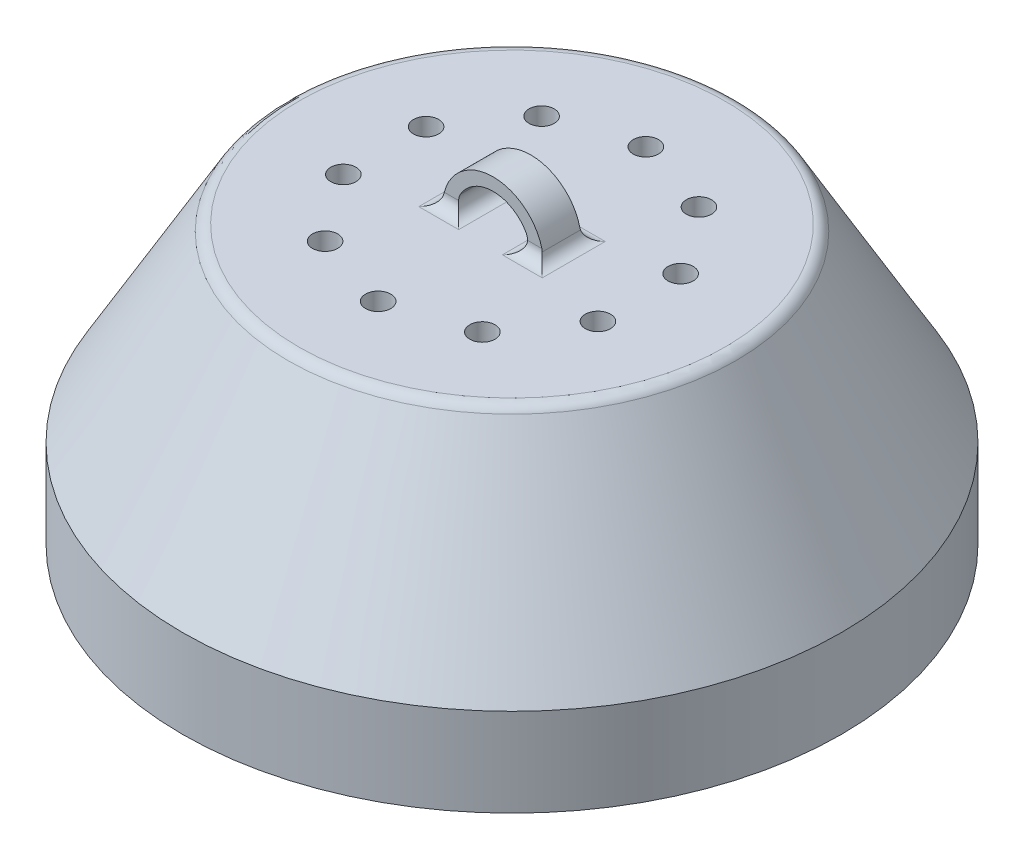
ISO-10303-21;
HEADER;
FILE_DESCRIPTION(('STEP AP214'),'2;1');
FILE_NAME('part.step','',(''),(''),'','','');
FILE_SCHEMA(('AUTOMOTIVE_DESIGN { 1 0 10303 214 1 1 1 1 }'));
ENDSEC;
DATA;
#1=APPLICATION_CONTEXT('core data for automotive mechanical design processes');
#2=APPLICATION_PROTOCOL_DEFINITION('international standard','automotive_design',2000,#1);
#3=PRODUCT_CONTEXT('',#1,'mechanical');
#4=PRODUCT('Part','Part','',(#3));
#5=PRODUCT_RELATED_PRODUCT_CATEGORY('part','',(#4));
#6=PRODUCT_DEFINITION_FORMATION('','',#4);
#7=PRODUCT_DEFINITION_CONTEXT('part definition',#1,'design');
#8=PRODUCT_DEFINITION('design','',#6,#7);
#9=PRODUCT_DEFINITION_SHAPE('','',#8);
#10=(LENGTH_UNIT() NAMED_UNIT(*) SI_UNIT(.MILLI.,.METRE.));
#11=(NAMED_UNIT(*) PLANE_ANGLE_UNIT() SI_UNIT($,.RADIAN.));
#12=(NAMED_UNIT(*) SI_UNIT($,.STERADIAN.) SOLID_ANGLE_UNIT());
#13=UNCERTAINTY_MEASURE_WITH_UNIT(LENGTH_MEASURE(1.E-05),#10,'distance_accuracy_value','');
#14=(GEOMETRIC_REPRESENTATION_CONTEXT(3) GLOBAL_UNCERTAINTY_ASSIGNED_CONTEXT((#13)) GLOBAL_UNIT_ASSIGNED_CONTEXT((#10,
#11,#12)) REPRESENTATION_CONTEXT('',''));
#15=CARTESIAN_POINT('',(0.,0.,0.));
#16=DIRECTION('',(0.,0.,1.));
#17=DIRECTION('',(1.,0.,0.));
#18=AXIS2_PLACEMENT_3D('',#15,#16,#17);
#19=CARTESIAN_POINT('',(0.,0.,0.));
#20=DIRECTION('',(0.,1.,0.));
#21=DIRECTION('',(0.,0.,1.));
#22=AXIS2_PLACEMENT_3D('',#19,#20,#21);
#23=PLANE('',#22);
#24=CARTESIAN_POINT('',(0.,0.,0.));
#25=DIRECTION('',(0.,1.,0.));
#26=DIRECTION('',(0.,0.,1.));
#27=AXIS2_PLACEMENT_3D('',#24,#25,#26);
#28=CIRCLE('',#27,25.75);
#29=CARTESIAN_POINT('',(0.,0.,25.75));
#30=VERTEX_POINT('',#29);
#31=EDGE_CURVE('E185',#30,#30,#28,.T.);
#32=ORIENTED_EDGE('',*,*,#31,.T.);
#33=EDGE_LOOP('',(#32));
#34=FACE_BOUND('',#33,.T.);
#35=CARTESIAN_POINT('',(0.,0.,0.));
#36=DIRECTION('',(0.,1.,0.));
#37=DIRECTION('',(0.,0.,1.));
#38=AXIS2_PLACEMENT_3D('',#35,#36,#37);
#39=CIRCLE('',#38,26.15);
#40=CARTESIAN_POINT('',(0.,0.,26.15));
#41=VERTEX_POINT('',#40);
#42=EDGE_CURVE('E312',#41,#41,#39,.T.);
#43=ORIENTED_EDGE('',*,*,#42,.F.);
#44=EDGE_LOOP('',(#43));
#45=FACE_BOUND('',#44,.T.);
#46=ADVANCED_FACE('F35',(#34,#45),#23,.F.);
#47=CARTESIAN_POINT('',(0.,7.,0.));
#48=DIRECTION('',(0.,-1.,0.));
#49=DIRECTION('',(0.,0.,-1.));
#50=AXIS2_PLACEMENT_3D('',#47,#48,#49);
#51=CYLINDRICAL_SURFACE('',#50,26.15);
#52=CARTESIAN_POINT('',(0.,7.,0.));
#53=DIRECTION('',(0.,1.,0.));
#54=DIRECTION('',(0.,0.,1.));
#55=AXIS2_PLACEMENT_3D('',#52,#53,#54);
#56=CIRCLE('',#55,26.15);
#57=CARTESIAN_POINT('',(0.,7.,26.15));
#58=VERTEX_POINT('',#57);
#59=EDGE_CURVE('E145',#58,#58,#56,.T.);
#60=ORIENTED_EDGE('',*,*,#59,.F.);
#61=EDGE_LOOP('',(#60));
#62=FACE_BOUND('',#61,.T.);
#63=ORIENTED_EDGE('',*,*,#42,.T.);
#64=EDGE_LOOP('',(#63));
#65=FACE_BOUND('',#64,.T.);
#66=ADVANCED_FACE('F253',(#62,#65),#51,.T.);
#67=CARTESIAN_POINT('',(0.,7.,0.));
#68=DIRECTION('',(0.,-1.,0.));
#69=DIRECTION('',(0.,0.,-1.));
#70=AXIS2_PLACEMENT_3D('',#67,#68,#69);
#71=CYLINDRICAL_SURFACE('',#70,24.75);
#72=CARTESIAN_POINT('',(0.,1.,0.));
#73=DIRECTION('',(0.,1.,0.));
#74=DIRECTION('',(0.,0.,1.));
#75=AXIS2_PLACEMENT_3D('',#72,#73,#74);
#76=CIRCLE('',#75,24.75);
#77=CARTESIAN_POINT('',(0.,1.,24.75));
#78=VERTEX_POINT('',#77);
#79=EDGE_CURVE('E188',#78,#78,#76,.F.);
#80=ORIENTED_EDGE('',*,*,#79,.T.);
#81=EDGE_LOOP('',(#80));
#82=FACE_BOUND('',#81,.T.);
#83=CARTESIAN_POINT('',(0.,7.,0.));
#84=DIRECTION('',(0.,-1.,0.));
#85=DIRECTION('',(0.,0.,-1.));
#86=AXIS2_PLACEMENT_3D('',#83,#84,#85);
#87=CIRCLE('',#86,24.75);
#88=CARTESIAN_POINT('',(0.,7.,-24.75));
#89=VERTEX_POINT('',#88);
#90=EDGE_CURVE('E315',#89,#89,#87,.T.);
#91=ORIENTED_EDGE('',*,*,#90,.F.);
#92=EDGE_LOOP('',(#91));
#93=FACE_BOUND('',#92,.T.);
#94=ADVANCED_FACE('F259',(#82,#93),#71,.F.);
#95=CARTESIAN_POINT('',(0.,7.,0.));
#96=DIRECTION('',(0.,-1.,0.));
#97=DIRECTION('',(0.,0.,1.));
#98=AXIS2_PLACEMENT_3D('',#95,#96,#97);
#99=CONICAL_SURFACE('',#98,26.15,0.5235987755983);
#100=CARTESIAN_POINT('',(0.,21.5,0.));
#101=DIRECTION('',(0.,-1.,0.));
#102=DIRECTION('',(0.,0.,-1.));
#103=AXIS2_PLACEMENT_3D('',#100,#101,#102);
#104=CIRCLE('',#103,17.7784210967504);
#105=CARTESIAN_POINT('',(0.,21.5,-17.7784210967504));
#106=VERTEX_POINT('',#105);
#107=EDGE_CURVE('E166',#106,#106,#104,.T.);
#108=ORIENTED_EDGE('',*,*,#107,.T.);
#109=EDGE_LOOP('',(#108));
#110=FACE_BOUND('',#109,.T.);
#111=ORIENTED_EDGE('',*,*,#59,.T.);
#112=EDGE_LOOP('',(#111));
#113=FACE_BOUND('',#112,.T.);
#114=ADVANCED_FACE('F284',(#110,#113),#99,.T.);
#115=CARTESIAN_POINT('',(0.,22.,0.));
#116=DIRECTION('',(0.,1.,0.));
#117=DIRECTION('',(0.,0.,1.));
#118=AXIS2_PLACEMENT_3D('',#115,#116,#117);
#119=PLANE('',#118);
#120=CARTESIAN_POINT('',(-6.24248112315431,22.,-8.59203815679193));
#121=DIRECTION('',(0.,1.,0.));
#122=DIRECTION('',(0.,0.,1.));
#123=AXIS2_PLACEMENT_3D('',#120,#121,#122);
#124=CIRCLE('',#123,1.0000000000004);
#125=CARTESIAN_POINT('',(-6.24248112315431,22.,-7.59203815679153));
#126=VERTEX_POINT('',#125);
#127=EDGE_CURVE('E390',#126,#126,#124,.T.);
#128=ORIENTED_EDGE('',*,*,#127,.F.);
#129=EDGE_LOOP('',(#128));
#130=FACE_BOUND('',#129,.T.);
#131=CARTESIAN_POINT('',(-10.100546631393,22.,-3.28186654325797));
#132=DIRECTION('',(0.,1.,0.));
#133=DIRECTION('',(0.,0.,1.));
#134=AXIS2_PLACEMENT_3D('',#131,#132,#133);
#135=CIRCLE('',#134,1.00000000000082);
#136=CARTESIAN_POINT('',(-10.100546631393,22.,-2.28186654325714));
#137=VERTEX_POINT('',#136);
#138=EDGE_CURVE('E384',#137,#137,#135,.T.);
#139=ORIENTED_EDGE('',*,*,#138,.F.);
#140=EDGE_LOOP('',(#139));
#141=FACE_BOUND('',#140,.T.);
#142=CARTESIAN_POINT('',(-10.1005466313925,22.,3.2818665432594));
#143=DIRECTION('',(0.,1.,0.));
#144=DIRECTION('',(0.,0.,1.));
#145=AXIS2_PLACEMENT_3D('',#142,#143,#144);
#146=CIRCLE('',#145,1.00000000000125);
#147=CARTESIAN_POINT('',(-10.1005466313925,22.,4.28186654326066));
#148=VERTEX_POINT('',#147);
#149=EDGE_CURVE('E378',#148,#148,#146,.T.);
#150=ORIENTED_EDGE('',*,*,#149,.F.);
#151=EDGE_LOOP('',(#150));
#152=FACE_BOUND('',#151,.T.);
#153=CARTESIAN_POINT('',(-6.24248112315309,22.,8.59203815679281));
#154=DIRECTION('',(0.,1.,0.));
#155=DIRECTION('',(0.,0.,1.));
#156=AXIS2_PLACEMENT_3D('',#153,#154,#155);
#157=CIRCLE('',#156,1.00000000000152);
#158=CARTESIAN_POINT('',(-6.24248112315309,22.,9.59203815679433));
#159=VERTEX_POINT('',#158);
#160=EDGE_CURVE('E372',#159,#159,#157,.T.);
#161=ORIENTED_EDGE('',*,*,#160,.F.);
#162=EDGE_LOOP('',(#161));
#163=FACE_BOUND('',#162,.T.);
#164=CARTESIAN_POINT('',(1.50664031238656E-12,22.,10.6203432270674));
#165=DIRECTION('',(0.,1.,0.));
#166=DIRECTION('',(0.,0.,1.));
#167=AXIS2_PLACEMENT_3D('',#164,#165,#166);
#168=CIRCLE('',#167,1.00000000000151);
#169=CARTESIAN_POINT('',(1.50664031238656E-12,22.,11.6203432270689));
#170=VERTEX_POINT('',#169);
#171=EDGE_CURVE('E366',#170,#170,#168,.T.);
#172=ORIENTED_EDGE('',*,*,#171,.F.);
#173=EDGE_LOOP('',(#172));
#174=FACE_BOUND('',#173,.T.);
#175=CARTESIAN_POINT('',(6.24248112315581,22.,8.59203815679193));
#176=DIRECTION('',(0.,1.,0.));
#177=DIRECTION('',(0.,0.,1.));
#178=AXIS2_PLACEMENT_3D('',#175,#176,#177);
#179=CIRCLE('',#178,1.00000000000123);
#180=CARTESIAN_POINT('',(6.24248112315581,22.,9.59203815679316));
#181=VERTEX_POINT('',#180);
#182=EDGE_CURVE('E360',#181,#181,#179,.T.);
#183=ORIENTED_EDGE('',*,*,#182,.F.);
#184=EDGE_LOOP('',(#183));
#185=FACE_BOUND('',#184,.T.);
#186=CARTESIAN_POINT('',(10.1005466313945,22.,3.28186654325797));
#187=DIRECTION('',(0.,1.,0.));
#188=DIRECTION('',(0.,0.,1.));
#189=AXIS2_PLACEMENT_3D('',#186,#187,#188);
#190=CIRCLE('',#189,1.00000000000078);
#191=CARTESIAN_POINT('',(10.1005466313945,22.,4.28186654325875));
#192=VERTEX_POINT('',#191);
#193=EDGE_CURVE('E354',#192,#192,#190,.T.);
#194=ORIENTED_EDGE('',*,*,#193,.F.);
#195=EDGE_LOOP('',(#194));
#196=FACE_BOUND('',#195,.T.);
#197=CARTESIAN_POINT('',(10.100546631394,22.,-3.2818665432594));
#198=DIRECTION('',(0.,1.,0.));
#199=DIRECTION('',(0.,0.,1.));
#200=AXIS2_PLACEMENT_3D('',#197,#198,#199);
#201=CIRCLE('',#200,1.00000000000032);
#202=CARTESIAN_POINT('',(10.100546631394,22.,-2.28186654325909));
#203=VERTEX_POINT('',#202);
#204=EDGE_CURVE('E348',#203,#203,#201,.T.);
#205=ORIENTED_EDGE('',*,*,#204,.F.);
#206=EDGE_LOOP('',(#205));
#207=FACE_BOUND('',#206,.T.);
#208=CARTESIAN_POINT('',(6.2424811231546,22.,-8.59203815679281));
#209=DIRECTION('',(0.,1.,0.));
#210=DIRECTION('',(0.,0.,1.));
#211=AXIS2_PLACEMENT_3D('',#208,#209,#210);
#212=CIRCLE('',#211,1.00000000000002);
#213=CARTESIAN_POINT('',(6.2424811231546,22.,-7.59203815679279));
#214=VERTEX_POINT('',#213);
#215=EDGE_CURVE('E342',#214,#214,#212,.T.);
#216=ORIENTED_EDGE('',*,*,#215,.F.);
#217=EDGE_LOOP('',(#216));
#218=FACE_BOUND('',#217,.T.);
#219=CARTESIAN_POINT('',(0.,22.,-10.6203432270674));
#220=DIRECTION('',(0.,1.,0.));
#221=DIRECTION('',(0.,0.,1.));
#222=AXIS2_PLACEMENT_3D('',#219,#220,#221);
#223=CIRCLE('',#222,1.);
#224=CARTESIAN_POINT('',(0.,22.,-9.62034322706737));
#225=VERTEX_POINT('',#224);
#226=EDGE_CURVE('E336',#225,#225,#223,.T.);
#227=ORIENTED_EDGE('',*,*,#226,.F.);
#228=EDGE_LOOP('',(#227));
#229=FACE_BOUND('',#228,.T.);
#230=CARTESIAN_POINT('',(0.,22.,0.));
#231=DIRECTION('',(0.,1.,0.));
#232=DIRECTION('',(0.,0.,1.));
#233=AXIS2_PLACEMENT_3D('',#230,#231,#232);
#234=CIRCLE('',#233,16.912395692966);
#235=CARTESIAN_POINT('',(0.,22.,16.912395692966));
#236=VERTEX_POINT('',#235);
#237=EDGE_CURVE('E163',#236,#236,#234,.T.);
#238=ORIENTED_EDGE('',*,*,#237,.T.);
#239=EDGE_LOOP('',(#238));
#240=FACE_BOUND('',#239,.T.);
#241=DIRECTION('',(1.,0.,0.));
#242=VECTOR('',#241,1.);
#243=CARTESIAN_POINT('',(0.,22.,-2.5));
#244=LINE('',#243,#242);
#245=CARTESIAN_POINT('',(1.73205080756888,22.,-2.5));
#246=VERTEX_POINT('',#245);
#247=CARTESIAN_POINT('',(4.89897948556636,22.,-2.5));
#248=VERTEX_POINT('',#247);
#249=EDGE_CURVE('E158',#246,#248,#244,.T.);
#250=ORIENTED_EDGE('',*,*,#249,.T.);
#251=DIRECTION('',(0.,0.,-1.));
#252=VECTOR('',#251,1.);
#253=CARTESIAN_POINT('',(4.89897948556636,22.,0.));
#254=LINE('',#253,#252);
#255=CARTESIAN_POINT('',(4.89897948556636,22.,2.5));
#256=VERTEX_POINT('',#255);
#257=EDGE_CURVE('E160',#248,#256,#254,.F.);
#258=ORIENTED_EDGE('',*,*,#257,.T.);
#259=DIRECTION('',(1.,0.,0.));
#260=VECTOR('',#259,1.);
#261=CARTESIAN_POINT('',(3.,22.,2.5));
#262=LINE('',#261,#260);
#263=CARTESIAN_POINT('',(1.73205080756888,22.,2.5));
#264=VERTEX_POINT('',#263);
#265=EDGE_CURVE('E150',#256,#264,#262,.F.);
#266=ORIENTED_EDGE('',*,*,#265,.T.);
#267=DIRECTION('',(0.,0.,-1.));
#268=VECTOR('',#267,1.);
#269=CARTESIAN_POINT('',(1.73205080756888,22.,0.));
#270=LINE('',#269,#268);
#271=EDGE_CURVE('E152',#264,#246,#270,.T.);
#272=ORIENTED_EDGE('',*,*,#271,.T.);
#273=EDGE_LOOP('',(#250,#258,#266,#272));
#274=FACE_BOUND('',#273,.T.);
#275=DIRECTION('',(1.,0.,0.));
#276=VECTOR('',#275,1.);
#277=CARTESIAN_POINT('',(0.,22.,-2.5));
#278=LINE('',#277,#276);
#279=CARTESIAN_POINT('',(-4.89897948556636,22.,-2.5));
#280=VERTEX_POINT('',#279);
#281=CARTESIAN_POINT('',(-1.73205080756888,22.,-2.5));
#282=VERTEX_POINT('',#281);
#283=EDGE_CURVE('E149',#280,#282,#278,.T.);
#284=ORIENTED_EDGE('',*,*,#283,.T.);
#285=DIRECTION('',(0.,0.,-1.));
#286=VECTOR('',#285,1.);
#287=CARTESIAN_POINT('',(-1.73205080756888,22.,0.));
#288=LINE('',#287,#286);
#289=CARTESIAN_POINT('',(-1.73205080756888,22.,2.5));
#290=VERTEX_POINT('',#289);
#291=EDGE_CURVE('E129',#282,#290,#288,.F.);
#292=ORIENTED_EDGE('',*,*,#291,.T.);
#293=DIRECTION('',(1.,0.,0.));
#294=VECTOR('',#293,1.);
#295=CARTESIAN_POINT('',(-4.,22.,2.5));
#296=LINE('',#295,#294);
#297=CARTESIAN_POINT('',(-4.89897948556636,22.,2.5));
#298=VERTEX_POINT('',#297);
#299=EDGE_CURVE('E139',#290,#298,#296,.F.);
#300=ORIENTED_EDGE('',*,*,#299,.T.);
#301=DIRECTION('',(0.,0.,-1.));
#302=VECTOR('',#301,1.);
#303=CARTESIAN_POINT('',(-4.89897948556636,22.,0.));
#304=LINE('',#303,#302);
#305=EDGE_CURVE('E144',#298,#280,#304,.T.);
#306=ORIENTED_EDGE('',*,*,#305,.T.);
#307=EDGE_LOOP('',(#284,#292,#300,#306));
#308=FACE_BOUND('',#307,.T.);
#309=ADVANCED_FACE('F147',(#130,#141,#152,#163,#174,#185,#196,#207,#218,#229,#240,#274,#308),
#119,.T.);
#310=CARTESIAN_POINT('',(0.,7.,0.));
#311=DIRECTION('',(0.,-1.,0.));
#312=DIRECTION('',(0.,0.,-1.));
#313=AXIS2_PLACEMENT_3D('',#310,#311,#312);
#314=CONICAL_SURFACE('',#313,24.75,0.5235987755983);
#315=ORIENTED_EDGE('',*,*,#90,.T.);
#316=EDGE_LOOP('',(#315));
#317=FACE_BOUND('',#316,.T.);
#318=CARTESIAN_POINT('',(0.,20.5,0.));
#319=DIRECTION('',(0.,1.,0.));
#320=DIRECTION('',(0.,0.,1.));
#321=AXIS2_PLACEMENT_3D('',#318,#319,#320);
#322=CIRCLE('',#321,16.95577136594);
#323=CARTESIAN_POINT('',(0.,20.5,16.95577136594));
#324=VERTEX_POINT('',#323);
#325=EDGE_CURVE('E318',#324,#324,#322,.F.);
#326=ORIENTED_EDGE('',*,*,#325,.F.);
#327=EDGE_LOOP('',(#326));
#328=FACE_BOUND('',#327,.T.);
#329=ADVANCED_FACE('F283',(#317,#328),#314,.F.);
#330=CARTESIAN_POINT('',(0.,20.5,0.));
#331=DIRECTION('',(0.,1.,0.));
#332=DIRECTION('',(0.,0.,1.));
#333=AXIS2_PLACEMENT_3D('',#330,#331,#332);
#334=PLANE('',#333);
#335=CARTESIAN_POINT('',(-6.24248112315431,20.5,-8.59203815679193));
#336=DIRECTION('',(0.,1.,0.));
#337=DIRECTION('',(0.,0.,1.));
#338=AXIS2_PLACEMENT_3D('',#335,#336,#337);
#339=CIRCLE('',#338,1.0000000000004);
#340=CARTESIAN_POINT('',(-6.24248112315431,20.5,-7.59203815679153));
#341=VERTEX_POINT('',#340);
#342=EDGE_CURVE('E387',#341,#341,#339,.F.);
#343=ORIENTED_EDGE('',*,*,#342,.F.);
#344=EDGE_LOOP('',(#343));
#345=FACE_BOUND('',#344,.T.);
#346=CARTESIAN_POINT('',(-10.100546631393,20.5,-3.28186654325797));
#347=DIRECTION('',(0.,1.,0.));
#348=DIRECTION('',(0.,0.,1.));
#349=AXIS2_PLACEMENT_3D('',#346,#347,#348);
#350=CIRCLE('',#349,1.00000000000082);
#351=CARTESIAN_POINT('',(-10.100546631393,20.5,-2.28186654325714));
#352=VERTEX_POINT('',#351);
#353=EDGE_CURVE('E381',#352,#352,#350,.F.);
#354=ORIENTED_EDGE('',*,*,#353,.F.);
#355=EDGE_LOOP('',(#354));
#356=FACE_BOUND('',#355,.T.);
#357=CARTESIAN_POINT('',(-10.1005466313925,20.5,3.2818665432594));
#358=DIRECTION('',(0.,1.,0.));
#359=DIRECTION('',(0.,0.,1.));
#360=AXIS2_PLACEMENT_3D('',#357,#358,#359);
#361=CIRCLE('',#360,1.00000000000125);
#362=CARTESIAN_POINT('',(-10.1005466313925,20.5,4.28186654326066));
#363=VERTEX_POINT('',#362);
#364=EDGE_CURVE('E375',#363,#363,#361,.F.);
#365=ORIENTED_EDGE('',*,*,#364,.F.);
#366=EDGE_LOOP('',(#365));
#367=FACE_BOUND('',#366,.T.);
#368=CARTESIAN_POINT('',(-6.24248112315309,20.5,8.59203815679281));
#369=DIRECTION('',(0.,1.,0.));
#370=DIRECTION('',(0.,0.,1.));
#371=AXIS2_PLACEMENT_3D('',#368,#369,#370);
#372=CIRCLE('',#371,1.00000000000152);
#373=CARTESIAN_POINT('',(-6.24248112315309,20.5,9.59203815679433));
#374=VERTEX_POINT('',#373);
#375=EDGE_CURVE('E369',#374,#374,#372,.F.);
#376=ORIENTED_EDGE('',*,*,#375,.F.);
#377=EDGE_LOOP('',(#376));
#378=FACE_BOUND('',#377,.T.);
#379=CARTESIAN_POINT('',(1.50664031238656E-12,20.5,10.6203432270674));
#380=DIRECTION('',(0.,1.,0.));
#381=DIRECTION('',(0.,0.,1.));
#382=AXIS2_PLACEMENT_3D('',#379,#380,#381);
#383=CIRCLE('',#382,1.00000000000151);
#384=CARTESIAN_POINT('',(1.50664031238656E-12,20.5,11.6203432270689));
#385=VERTEX_POINT('',#384);
#386=EDGE_CURVE('E363',#385,#385,#383,.F.);
#387=ORIENTED_EDGE('',*,*,#386,.F.);
#388=EDGE_LOOP('',(#387));
#389=FACE_BOUND('',#388,.T.);
#390=CARTESIAN_POINT('',(6.24248112315581,20.5,8.59203815679193));
#391=DIRECTION('',(0.,1.,0.));
#392=DIRECTION('',(0.,0.,1.));
#393=AXIS2_PLACEMENT_3D('',#390,#391,#392);
#394=CIRCLE('',#393,1.00000000000123);
#395=CARTESIAN_POINT('',(6.24248112315581,20.5,9.59203815679316));
#396=VERTEX_POINT('',#395);
#397=EDGE_CURVE('E357',#396,#396,#394,.F.);
#398=ORIENTED_EDGE('',*,*,#397,.F.);
#399=EDGE_LOOP('',(#398));
#400=FACE_BOUND('',#399,.T.);
#401=CARTESIAN_POINT('',(10.1005466313945,20.5,3.28186654325797));
#402=DIRECTION('',(0.,1.,0.));
#403=DIRECTION('',(0.,0.,1.));
#404=AXIS2_PLACEMENT_3D('',#401,#402,#403);
#405=CIRCLE('',#404,1.00000000000078);
#406=CARTESIAN_POINT('',(10.1005466313945,20.5,4.28186654325875));
#407=VERTEX_POINT('',#406);
#408=EDGE_CURVE('E351',#407,#407,#405,.F.);
#409=ORIENTED_EDGE('',*,*,#408,.F.);
#410=EDGE_LOOP('',(#409));
#411=FACE_BOUND('',#410,.T.);
#412=CARTESIAN_POINT('',(10.100546631394,20.5,-3.2818665432594));
#413=DIRECTION('',(0.,1.,0.));
#414=DIRECTION('',(0.,0.,1.));
#415=AXIS2_PLACEMENT_3D('',#412,#413,#414);
#416=CIRCLE('',#415,1.00000000000032);
#417=CARTESIAN_POINT('',(10.100546631394,20.5,-2.28186654325909));
#418=VERTEX_POINT('',#417);
#419=EDGE_CURVE('E345',#418,#418,#416,.F.);
#420=ORIENTED_EDGE('',*,*,#419,.F.);
#421=EDGE_LOOP('',(#420));
#422=FACE_BOUND('',#421,.T.);
#423=CARTESIAN_POINT('',(6.2424811231546,20.5,-8.59203815679281));
#424=DIRECTION('',(0.,1.,0.));
#425=DIRECTION('',(0.,0.,1.));
#426=AXIS2_PLACEMENT_3D('',#423,#424,#425);
#427=CIRCLE('',#426,1.00000000000002);
#428=CARTESIAN_POINT('',(6.2424811231546,20.5,-7.59203815679279));
#429=VERTEX_POINT('',#428);
#430=EDGE_CURVE('E339',#429,#429,#427,.F.);
#431=ORIENTED_EDGE('',*,*,#430,.F.);
#432=EDGE_LOOP('',(#431));
#433=FACE_BOUND('',#432,.T.);
#434=CARTESIAN_POINT('',(0.,20.5,-10.6203432270674));
#435=DIRECTION('',(0.,1.,0.));
#436=DIRECTION('',(0.,0.,1.));
#437=AXIS2_PLACEMENT_3D('',#434,#435,#436);
#438=CIRCLE('',#437,1.);
#439=CARTESIAN_POINT('',(0.,20.5,-9.62034322706737));
#440=VERTEX_POINT('',#439);
#441=EDGE_CURVE('E308',#440,#440,#438,.F.);
#442=ORIENTED_EDGE('',*,*,#441,.F.);
#443=EDGE_LOOP('',(#442));
#444=FACE_BOUND('',#443,.T.);
#445=ORIENTED_EDGE('',*,*,#325,.T.);
#446=EDGE_LOOP('',(#445));
#447=FACE_BOUND('',#446,.T.);
#448=ADVANCED_FACE('F422',(#345,#356,#367,#378,#389,#400,#411,#422,#433,#444,#447),#334,.F.);
#449=CARTESIAN_POINT('',(0.,22.,1.5));
#450=DIRECTION('',(0.,0.,-1.));
#451=DIRECTION('',(-1.,0.,0.));
#452=AXIS2_PLACEMENT_3D('',#449,#450,#451);
#453=CYLINDRICAL_SURFACE('',#452,4.);
#454=CARTESIAN_POINT('',(0.,22.,1.5));
#455=DIRECTION('',(0.,0.,1.));
#456=DIRECTION('',(1.,0.,0.));
#457=AXIS2_PLACEMENT_3D('',#454,#455,#456);
#458=CIRCLE('',#457,4.);
#459=CARTESIAN_POINT('',(3.87298334620742,23.,1.5));
#460=VERTEX_POINT('',#459);
#461=CARTESIAN_POINT('',(-3.87298334620742,23.,1.5));
#462=VERTEX_POINT('',#461);
#463=EDGE_CURVE('E327',#460,#462,#458,.T.);
#464=ORIENTED_EDGE('',*,*,#463,.F.);
#465=CARTESIAN_POINT('',(3.87298334620742,23.,1.5));
#466=CARTESIAN_POINT('',(3.88161367079,22.9665400879856,1.49998709194956));
#467=CARTESIAN_POINT('',(3.88977885326883,22.9331434653097,1.5016643131653));
#468=CARTESIAN_POINT('',(3.90517893401717,22.8664767986431,1.50839901412834));
#469=CARTESIAN_POINT('',(3.91241383228689,22.8332067546523,1.51345649387485));
#470=CARTESIAN_POINT('',(3.91918358845308,22.8,1.52020410288673));
#471=B_SPLINE_CURVE_WITH_KNOTS('',3,(#465,#466,#467,#468,#469,#470),.UNSPECIFIED.,.F.,.F.,(4,2,
4),(0.,0.103263542156258,0.206527084287963),.UNSPECIFIED.);
#472=CARTESIAN_POINT('',(3.91918358845308,22.8,1.52020410288673));
#473=VERTEX_POINT('',#472);
#474=EDGE_CURVE('E220',#460,#473,#471,.T.);
#475=ORIENTED_EDGE('',*,*,#474,.T.);
#476=DIRECTION('',(0.,0.,-1.));
#477=VECTOR('',#476,1.);
#478=CARTESIAN_POINT('',(3.91918358845309,22.8,1.5));
#479=LINE('',#478,#477);
#480=CARTESIAN_POINT('',(3.91918358845308,22.8,-1.52020410288673));
#481=VERTEX_POINT('',#480);
#482=EDGE_CURVE('E170',#473,#481,#479,.T.);
#483=ORIENTED_EDGE('',*,*,#482,.T.);
#484=CARTESIAN_POINT('',(3.91918358845308,22.8,-1.52020410288673));
#485=CARTESIAN_POINT('',(3.91241383228687,22.8332067546522,-1.51345649387486));
#486=CARTESIAN_POINT('',(3.90517893401715,22.8664767986431,-1.50839901412835));
#487=CARTESIAN_POINT('',(3.88977885326885,22.9331434653097,-1.50166431316529));
#488=CARTESIAN_POINT('',(3.88161367079005,22.9665400879856,-1.49998709194953));
#489=CARTESIAN_POINT('',(3.87298334620752,23.,-1.49999999999995));
#490=B_SPLINE_CURVE_WITH_KNOTS('',3,(#484,#485,#486,#487,#488,#489),.UNSPECIFIED.,.F.,.F.,(4,2,
4),(0.,0.103263542131702,0.206527084287951),.UNSPECIFIED.);
#491=CARTESIAN_POINT('',(3.87298334620742,23.,-1.5));
#492=VERTEX_POINT('',#491);
#493=EDGE_CURVE('E191',#481,#492,#490,.T.);
#494=ORIENTED_EDGE('',*,*,#493,.T.);
#495=CARTESIAN_POINT('',(0.,22.,-1.5));
#496=DIRECTION('',(0.,0.,1.));
#497=DIRECTION('',(1.,0.,0.));
#498=AXIS2_PLACEMENT_3D('',#495,#496,#497);
#499=CIRCLE('',#498,4.);
#500=CARTESIAN_POINT('',(-3.87298334620742,23.,-1.5));
#501=VERTEX_POINT('',#500);
#502=EDGE_CURVE('E307',#492,#501,#499,.T.);
#503=ORIENTED_EDGE('',*,*,#502,.T.);
#504=CARTESIAN_POINT('',(-3.87298334620742,23.,-1.5));
#505=CARTESIAN_POINT('',(-3.88161367079,22.9665400879856,-1.49998709194956));
#506=CARTESIAN_POINT('',(-3.88977885326883,22.9331434653097,-1.5016643131653));
#507=CARTESIAN_POINT('',(-3.90517893401717,22.8664767986431,-1.50839901412834));
#508=CARTESIAN_POINT('',(-3.91241383228689,22.8332067546523,-1.51345649387485));
#509=CARTESIAN_POINT('',(-3.91918358845308,22.8,-1.52020410288673));
#510=B_SPLINE_CURVE_WITH_KNOTS('',3,(#504,#505,#506,#507,#508,#509),.UNSPECIFIED.,.F.,.F.,(4,2,
4),(0.,0.103263542156258,0.206527084287963),.UNSPECIFIED.);
#511=CARTESIAN_POINT('',(-3.91918358845308,22.8,-1.52020410288673));
#512=VERTEX_POINT('',#511);
#513=EDGE_CURVE('E44',#501,#512,#510,.T.);
#514=ORIENTED_EDGE('',*,*,#513,.T.);
#515=DIRECTION('',(0.,0.,-1.));
#516=VECTOR('',#515,1.);
#517=CARTESIAN_POINT('',(-3.91918358845309,22.8,1.5));
#518=LINE('',#517,#516);
#519=CARTESIAN_POINT('',(-3.91918358845308,22.8,1.52020410288673));
#520=VERTEX_POINT('',#519);
#521=EDGE_CURVE('E51',#512,#520,#518,.F.);
#522=ORIENTED_EDGE('',*,*,#521,.T.);
#523=CARTESIAN_POINT('',(-3.91918358845308,22.8,1.52020410288673));
#524=CARTESIAN_POINT('',(-3.91241383228687,22.8332067546522,1.51345649387486));
#525=CARTESIAN_POINT('',(-3.90517893401715,22.8664767986431,1.50839901412835));
#526=CARTESIAN_POINT('',(-3.88977885326885,22.9331434653097,1.50166431316529));
#527=CARTESIAN_POINT('',(-3.88161367079005,22.9665400879856,1.49998709194953));
#528=CARTESIAN_POINT('',(-3.87298334620752,23.,1.49999999999995));
#529=B_SPLINE_CURVE_WITH_KNOTS('',3,(#523,#524,#525,#526,#527,#528),.UNSPECIFIED.,.F.,.F.,(4,2,
4),(0.,0.103263542131702,0.206527084287951),.UNSPECIFIED.);
#530=EDGE_CURVE('E12',#520,#462,#529,.T.);
#531=ORIENTED_EDGE('',*,*,#530,.T.);
#532=EDGE_LOOP('',(#464,#475,#483,#494,#503,#514,#522,#531));
#533=FACE_BOUND('',#532,.T.);
#534=ADVANCED_FACE('F200',(#533),#453,.T.);
#535=CARTESIAN_POINT('',(0.,22.,1.5));
#536=DIRECTION('',(0.,0.,-1.));
#537=DIRECTION('',(-1.,0.,0.));
#538=AXIS2_PLACEMENT_3D('',#535,#536,#537);
#539=CYLINDRICAL_SURFACE('',#538,3.);
#540=CARTESIAN_POINT('',(0.,22.,-1.5));
#541=DIRECTION('',(0.,0.,-1.));
#542=DIRECTION('',(1.,0.,0.));
#543=AXIS2_PLACEMENT_3D('',#540,#541,#542);
#544=CIRCLE('',#543,3.);
#545=CARTESIAN_POINT('',(-2.59807621135332,23.5,-1.5));
#546=VERTEX_POINT('',#545);
#547=CARTESIAN_POINT('',(2.59807621135332,23.5,-1.5));
#548=VERTEX_POINT('',#547);
#549=EDGE_CURVE('E324',#546,#548,#544,.T.);
#550=ORIENTED_EDGE('',*,*,#549,.T.);
#551=DIRECTION('',(0.,0.,-1.));
#552=VECTOR('',#551,1.);
#553=CARTESIAN_POINT('',(2.59807621135332,23.5,1.5));
#554=LINE('',#553,#552);
#555=CARTESIAN_POINT('',(2.59807621135332,23.5,1.5));
#556=VERTEX_POINT('',#555);
#557=EDGE_CURVE('E179',#548,#556,#554,.F.);
#558=ORIENTED_EDGE('',*,*,#557,.T.);
#559=CARTESIAN_POINT('',(0.,22.,1.5));
#560=DIRECTION('',(0.,0.,-1.));
#561=DIRECTION('',(1.,0.,0.));
#562=AXIS2_PLACEMENT_3D('',#559,#560,#561);
#563=CIRCLE('',#562,3.);
#564=CARTESIAN_POINT('',(-2.59807621135332,23.5,1.5));
#565=VERTEX_POINT('',#564);
#566=EDGE_CURVE('E321',#565,#556,#563,.T.);
#567=ORIENTED_EDGE('',*,*,#566,.F.);
#568=DIRECTION('',(0.,0.,-1.));
#569=VECTOR('',#568,1.);
#570=CARTESIAN_POINT('',(-2.59807621135332,23.5,1.5));
#571=LINE('',#570,#569);
#572=EDGE_CURVE('E176',#565,#546,#571,.T.);
#573=ORIENTED_EDGE('',*,*,#572,.T.);
#574=EDGE_LOOP('',(#550,#558,#567,#573));
#575=FACE_BOUND('',#574,.T.);
#576=ADVANCED_FACE('F514',(#575),#539,.F.);
#577=CARTESIAN_POINT('',(0.,22.,1.5));
#578=DIRECTION('',(0.,0.,1.));
#579=DIRECTION('',(1.,0.,0.));
#580=AXIS2_PLACEMENT_3D('',#577,#578,#579);
#581=PLANE('',#580);
#582=CARTESIAN_POINT('',(1.73205080756888,23.,1.5));
#583=DIRECTION('',(0.,0.,1.));
#584=DIRECTION('',(1.,0.,0.));
#585=AXIS2_PLACEMENT_3D('',#582,#583,#584);
#586=CIRCLE('',#585,1.);
#587=CARTESIAN_POINT('',(2.73205080756888,23.,1.5));
#588=VERTEX_POINT('',#587);
#589=EDGE_CURVE('E227',#556,#588,#586,.F.);
#590=ORIENTED_EDGE('',*,*,#589,.T.);
#591=DIRECTION('',(1.,0.,0.));
#592=VECTOR('',#591,1.);
#593=CARTESIAN_POINT('',(4.,23.,1.5));
#594=LINE('',#593,#592);
#595=EDGE_CURVE('E183',#588,#460,#594,.T.);
#596=ORIENTED_EDGE('',*,*,#595,.T.);
#597=ORIENTED_EDGE('',*,*,#463,.T.);
#598=DIRECTION('',(1.,0.,0.));
#599=VECTOR('',#598,1.);
#600=CARTESIAN_POINT('',(-3.,23.,1.5));
#601=LINE('',#600,#599);
#602=CARTESIAN_POINT('',(-2.73205080756888,23.,1.5));
#603=VERTEX_POINT('',#602);
#604=EDGE_CURVE('E181',#462,#603,#601,.T.);
#605=ORIENTED_EDGE('',*,*,#604,.T.);
#606=CARTESIAN_POINT('',(-1.73205080756888,23.,1.5));
#607=DIRECTION('',(0.,0.,1.));
#608=DIRECTION('',(1.,0.,0.));
#609=AXIS2_PLACEMENT_3D('',#606,#607,#608);
#610=CIRCLE('',#609,1.);
#611=EDGE_CURVE('E132',#603,#565,#610,.F.);
#612=ORIENTED_EDGE('',*,*,#611,.T.);
#613=ORIENTED_EDGE('',*,*,#566,.T.);
#614=EDGE_LOOP('',(#590,#596,#597,#605,#612,#613));
#615=FACE_BOUND('',#614,.T.);
#616=ADVANCED_FACE('F274',(#615),#581,.T.);
#617=CARTESIAN_POINT('',(0.,22.,-1.5));
#618=DIRECTION('',(0.,0.,1.));
#619=DIRECTION('',(1.,0.,0.));
#620=AXIS2_PLACEMENT_3D('',#617,#618,#619);
#621=PLANE('',#620);
#622=ORIENTED_EDGE('',*,*,#502,.F.);
#623=DIRECTION('',(1.,0.,0.));
#624=VECTOR('',#623,1.);
#625=CARTESIAN_POINT('',(0.,23.,-1.5));
#626=LINE('',#625,#624);
#627=CARTESIAN_POINT('',(2.73205080756888,23.,-1.5));
#628=VERTEX_POINT('',#627);
#629=EDGE_CURVE('E174',#492,#628,#626,.F.);
#630=ORIENTED_EDGE('',*,*,#629,.T.);
#631=CARTESIAN_POINT('',(1.73205080756888,23.,-1.5));
#632=DIRECTION('',(0.,0.,1.));
#633=DIRECTION('',(1.,0.,0.));
#634=AXIS2_PLACEMENT_3D('',#631,#632,#633);
#635=CIRCLE('',#634,1.);
#636=EDGE_CURVE('E198',#628,#548,#635,.T.);
#637=ORIENTED_EDGE('',*,*,#636,.T.);
#638=ORIENTED_EDGE('',*,*,#549,.F.);
#639=CARTESIAN_POINT('',(-1.73205080756888,23.,-1.5));
#640=DIRECTION('',(0.,0.,1.));
#641=DIRECTION('',(1.,0.,0.));
#642=AXIS2_PLACEMENT_3D('',#639,#640,#641);
#643=CIRCLE('',#642,1.);
#644=CARTESIAN_POINT('',(-2.73205080756888,23.,-1.5));
#645=VERTEX_POINT('',#644);
#646=EDGE_CURVE('E226',#546,#645,#643,.T.);
#647=ORIENTED_EDGE('',*,*,#646,.T.);
#648=DIRECTION('',(1.,0.,0.));
#649=VECTOR('',#648,1.);
#650=CARTESIAN_POINT('',(0.,23.,-1.5));
#651=LINE('',#650,#649);
#652=EDGE_CURVE('E172',#645,#501,#651,.F.);
#653=ORIENTED_EDGE('',*,*,#652,.T.);
#654=EDGE_LOOP('',(#622,#630,#637,#638,#647,#653));
#655=FACE_BOUND('',#654,.T.);
#656=ADVANCED_FACE('F267',(#655),#621,.F.);
#657=CARTESIAN_POINT('',(0.,21.,0.));
#658=DIRECTION('',(0.,1.,0.));
#659=DIRECTION('',(0.,0.,1.));
#660=AXIS2_PLACEMENT_3D('',#657,#658,#659);
#661=TOROIDAL_SURFACE('',#660,16.912395692966,1.);
#662=ORIENTED_EDGE('',*,*,#107,.F.);
#663=EDGE_LOOP('',(#662));
#664=FACE_BOUND('',#663,.T.);
#665=ORIENTED_EDGE('',*,*,#237,.F.);
#666=EDGE_LOOP('',(#665));
#667=FACE_BOUND('',#666,.T.);
#668=ADVANCED_FACE('F265',(#664,#667),#661,.T.);
#669=CARTESIAN_POINT('',(1.73205080756888,23.,1.5));
#670=DIRECTION('',(0.,0.,-1.));
#671=DIRECTION('',(-1.,0.,0.));
#672=AXIS2_PLACEMENT_3D('',#669,#670,#671);
#673=CYLINDRICAL_SURFACE('',#672,1.);
#674=CARTESIAN_POINT('',(1.73205080756888,23.,-2.5));
#675=DIRECTION('',(0.707106781186547,0.,-0.707106781186547));
#676=DIRECTION('',(-0.707106781186547,0.,-0.707106781186547));
#677=AXIS2_PLACEMENT_3D('',#674,#675,#676);
#678=ELLIPSE('',#677,1.41421356237309,1.);
#679=EDGE_CURVE('E300',#246,#628,#678,.F.);
#680=ORIENTED_EDGE('',*,*,#679,.F.);
#681=ORIENTED_EDGE('',*,*,#271,.F.);
#682=CARTESIAN_POINT('',(1.73205080756888,23.,2.5));
#683=DIRECTION('',(-0.707106781186547,0.,-0.707106781186547));
#684=DIRECTION('',(-0.707106781186547,0.,0.707106781186547));
#685=AXIS2_PLACEMENT_3D('',#682,#683,#684);
#686=ELLIPSE('',#685,1.41421356237309,1.);
#687=EDGE_CURVE('E304',#588,#264,#686,.T.);
#688=ORIENTED_EDGE('',*,*,#687,.F.);
#689=ORIENTED_EDGE('',*,*,#589,.F.);
#690=ORIENTED_EDGE('',*,*,#557,.F.);
#691=ORIENTED_EDGE('',*,*,#636,.F.);
#692=EDGE_LOOP('',(#680,#681,#688,#689,#690,#691));
#693=FACE_BOUND('',#692,.T.);
#694=ADVANCED_FACE('F216',(#693),#673,.F.);
#695=CARTESIAN_POINT('',(0.,23.,2.5));
#696=DIRECTION('',(-1.,0.,0.));
#697=DIRECTION('',(0.,0.,1.));
#698=AXIS2_PLACEMENT_3D('',#695,#696,#697);
#699=CYLINDRICAL_SURFACE('',#698,1.);
#700=ORIENTED_EDGE('',*,*,#687,.T.);
#701=ORIENTED_EDGE('',*,*,#265,.F.);
#702=CARTESIAN_POINT('',(4.89897948556636,23.,2.5));
#703=DIRECTION('',(-0.707106781186547,0.,0.707106781186547));
#704=DIRECTION('',(-0.707106781186547,0.,-0.707106781186547));
#705=AXIS2_PLACEMENT_3D('',#702,#703,#704);
#706=ELLIPSE('',#705,1.41421356237309,1.);
#707=EDGE_CURVE('E296',#473,#256,#706,.T.);
#708=ORIENTED_EDGE('',*,*,#707,.F.);
#709=ORIENTED_EDGE('',*,*,#474,.F.);
#710=ORIENTED_EDGE('',*,*,#595,.F.);
#711=EDGE_LOOP('',(#700,#701,#708,#709,#710));
#712=FACE_BOUND('',#711,.T.);
#713=ADVANCED_FACE('F210',(#712),#699,.F.);
#714=CARTESIAN_POINT('',(0.,23.,-2.5));
#715=DIRECTION('',(1.,0.,0.));
#716=DIRECTION('',(0.,0.,-1.));
#717=AXIS2_PLACEMENT_3D('',#714,#715,#716);
#718=CYLINDRICAL_SURFACE('',#717,1.);
#719=ORIENTED_EDGE('',*,*,#629,.F.);
#720=ORIENTED_EDGE('',*,*,#493,.F.);
#721=CARTESIAN_POINT('',(4.89897948556636,23.,-2.5));
#722=DIRECTION('',(0.707106781186547,0.,0.707106781186547));
#723=DIRECTION('',(0.707106781186547,0.,-0.707106781186547));
#724=AXIS2_PLACEMENT_3D('',#721,#722,#723);
#725=ELLIPSE('',#724,1.41421356237309,1.);
#726=EDGE_CURVE('E294',#248,#481,#725,.F.);
#727=ORIENTED_EDGE('',*,*,#726,.F.);
#728=ORIENTED_EDGE('',*,*,#249,.F.);
#729=ORIENTED_EDGE('',*,*,#679,.T.);
#730=EDGE_LOOP('',(#719,#720,#727,#728,#729));
#731=FACE_BOUND('',#730,.T.);
#732=ADVANCED_FACE('F204',(#731),#718,.F.);
#733=CARTESIAN_POINT('',(4.89897948556636,23.,1.5));
#734=DIRECTION('',(0.,0.,-1.));
#735=DIRECTION('',(-1.,0.,0.));
#736=AXIS2_PLACEMENT_3D('',#733,#734,#735);
#737=CYLINDRICAL_SURFACE('',#736,1.);
#738=ORIENTED_EDGE('',*,*,#707,.T.);
#739=ORIENTED_EDGE('',*,*,#257,.F.);
#740=ORIENTED_EDGE('',*,*,#726,.T.);
#741=ORIENTED_EDGE('',*,*,#482,.F.);
#742=EDGE_LOOP('',(#738,#739,#740,#741));
#743=FACE_BOUND('',#742,.T.);
#744=ADVANCED_FACE('F209',(#743),#737,.F.);
#745=CARTESIAN_POINT('',(-4.89897948556636,23.,1.5));
#746=DIRECTION('',(0.,0.,-1.));
#747=DIRECTION('',(-1.,0.,0.));
#748=AXIS2_PLACEMENT_3D('',#745,#746,#747);
#749=CYLINDRICAL_SURFACE('',#748,1.);
#750=CARTESIAN_POINT('',(-4.89897948556636,23.,-2.5));
#751=DIRECTION('',(0.707106781186547,0.,-0.707106781186547));
#752=DIRECTION('',(-0.707106781186547,0.,-0.707106781186547));
#753=AXIS2_PLACEMENT_3D('',#750,#751,#752);
#754=ELLIPSE('',#753,1.41421356237309,1.);
#755=EDGE_CURVE('E135',#280,#512,#754,.F.);
#756=ORIENTED_EDGE('',*,*,#755,.F.);
#757=ORIENTED_EDGE('',*,*,#305,.F.);
#758=CARTESIAN_POINT('',(-4.89897948556636,23.,2.5));
#759=DIRECTION('',(-0.707106781186547,0.,-0.707106781186547));
#760=DIRECTION('',(-0.707106781186547,0.,0.707106781186547));
#761=AXIS2_PLACEMENT_3D('',#758,#759,#760);
#762=ELLIPSE('',#761,1.41421356237309,1.);
#763=EDGE_CURVE('E39',#520,#298,#762,.T.);
#764=ORIENTED_EDGE('',*,*,#763,.F.);
#765=ORIENTED_EDGE('',*,*,#521,.F.);
#766=EDGE_LOOP('',(#756,#757,#764,#765));
#767=FACE_BOUND('',#766,.T.);
#768=ADVANCED_FACE('F246',(#767),#749,.F.);
#769=CARTESIAN_POINT('',(0.,23.,2.5));
#770=DIRECTION('',(-1.,0.,0.));
#771=DIRECTION('',(0.,0.,1.));
#772=AXIS2_PLACEMENT_3D('',#769,#770,#771);
#773=CYLINDRICAL_SURFACE('',#772,1.);
#774=ORIENTED_EDGE('',*,*,#763,.T.);
#775=ORIENTED_EDGE('',*,*,#299,.F.);
#776=CARTESIAN_POINT('',(-1.73205080756888,23.,2.5));
#777=DIRECTION('',(-0.707106781186547,0.,0.707106781186547));
#778=DIRECTION('',(-0.707106781186547,0.,-0.707106781186547));
#779=AXIS2_PLACEMENT_3D('',#776,#777,#778);
#780=ELLIPSE('',#779,1.41421356237309,1.);
#781=EDGE_CURVE('E124',#603,#290,#780,.T.);
#782=ORIENTED_EDGE('',*,*,#781,.F.);
#783=ORIENTED_EDGE('',*,*,#604,.F.);
#784=ORIENTED_EDGE('',*,*,#530,.F.);
#785=EDGE_LOOP('',(#774,#775,#782,#783,#784));
#786=FACE_BOUND('',#785,.T.);
#787=ADVANCED_FACE('F140',(#786),#773,.F.);
#788=CARTESIAN_POINT('',(0.,23.,-2.5));
#789=DIRECTION('',(1.,0.,0.));
#790=DIRECTION('',(0.,0.,-1.));
#791=AXIS2_PLACEMENT_3D('',#788,#789,#790);
#792=CYLINDRICAL_SURFACE('',#791,1.);
#793=ORIENTED_EDGE('',*,*,#652,.F.);
#794=CARTESIAN_POINT('',(-1.73205080756888,23.,-2.5));
#795=DIRECTION('',(0.707106781186547,0.,0.707106781186547));
#796=DIRECTION('',(0.707106781186547,0.,-0.707106781186547));
#797=AXIS2_PLACEMENT_3D('',#794,#795,#796);
#798=ELLIPSE('',#797,1.41421356237309,1.);
#799=EDGE_CURVE('E136',#282,#645,#798,.F.);
#800=ORIENTED_EDGE('',*,*,#799,.F.);
#801=ORIENTED_EDGE('',*,*,#283,.F.);
#802=ORIENTED_EDGE('',*,*,#755,.T.);
#803=ORIENTED_EDGE('',*,*,#513,.F.);
#804=EDGE_LOOP('',(#793,#800,#801,#802,#803));
#805=FACE_BOUND('',#804,.T.);
#806=ADVANCED_FACE('F240',(#805),#792,.F.);
#807=CARTESIAN_POINT('',(-1.73205080756888,23.,1.5));
#808=DIRECTION('',(0.,0.,-1.));
#809=DIRECTION('',(-1.,0.,0.));
#810=AXIS2_PLACEMENT_3D('',#807,#808,#809);
#811=CYLINDRICAL_SURFACE('',#810,1.);
#812=ORIENTED_EDGE('',*,*,#781,.T.);
#813=ORIENTED_EDGE('',*,*,#291,.F.);
#814=ORIENTED_EDGE('',*,*,#799,.T.);
#815=ORIENTED_EDGE('',*,*,#646,.F.);
#816=ORIENTED_EDGE('',*,*,#572,.F.);
#817=ORIENTED_EDGE('',*,*,#611,.F.);
#818=EDGE_LOOP('',(#812,#813,#814,#815,#816,#817));
#819=FACE_BOUND('',#818,.T.);
#820=ADVANCED_FACE('F126',(#819),#811,.F.);
#821=CARTESIAN_POINT('',(0.,1.,0.));
#822=DIRECTION('',(0.,1.,0.));
#823=DIRECTION('',(0.,0.,1.));
#824=AXIS2_PLACEMENT_3D('',#821,#822,#823);
#825=TOROIDAL_SURFACE('',#824,25.75,1.);
#826=ORIENTED_EDGE('',*,*,#79,.F.);
#827=EDGE_LOOP('',(#826));
#828=FACE_BOUND('',#827,.T.);
#829=ORIENTED_EDGE('',*,*,#31,.F.);
#830=EDGE_LOOP('',(#829));
#831=FACE_BOUND('',#830,.T.);
#832=ADVANCED_FACE('F37',(#828,#831),#825,.T.);
#833=CARTESIAN_POINT('',(0.,-0.001000000000001,-10.6203432270674));
#834=DIRECTION('',(0.,1.,0.));
#835=DIRECTION('',(0.,0.,1.));
#836=AXIS2_PLACEMENT_3D('',#833,#834,#835);
#837=CYLINDRICAL_SURFACE('',#836,1.);
#838=ORIENTED_EDGE('',*,*,#226,.T.);
#839=EDGE_LOOP('',(#838));
#840=FACE_BOUND('',#839,.T.);
#841=ORIENTED_EDGE('',*,*,#441,.T.);
#842=EDGE_LOOP('',(#841));
#843=FACE_BOUND('',#842,.T.);
#844=ADVANCED_FACE('F415',(#840,#843),#837,.F.);
#845=CARTESIAN_POINT('',(6.2424811231546,-0.001000000000001,-8.59203815679281));
#846=DIRECTION('',(0.,1.,0.));
#847=DIRECTION('',(0.,0.,1.));
#848=AXIS2_PLACEMENT_3D('',#845,#846,#847);
#849=CYLINDRICAL_SURFACE('',#848,1.00000000000002);
#850=ORIENTED_EDGE('',*,*,#215,.T.);
#851=EDGE_LOOP('',(#850));
#852=FACE_BOUND('',#851,.T.);
#853=ORIENTED_EDGE('',*,*,#430,.T.);
#854=EDGE_LOOP('',(#853));
#855=FACE_BOUND('',#854,.T.);
#856=ADVANCED_FACE('F418',(#852,#855),#849,.F.);
#857=CARTESIAN_POINT('',(10.100546631394,-0.001000000000001,-3.2818665432594));
#858=DIRECTION('',(0.,1.,0.));
#859=DIRECTION('',(0.,0.,1.));
#860=AXIS2_PLACEMENT_3D('',#857,#858,#859);
#861=CYLINDRICAL_SURFACE('',#860,1.00000000000032);
#862=ORIENTED_EDGE('',*,*,#204,.T.);
#863=EDGE_LOOP('',(#862));
#864=FACE_BOUND('',#863,.T.);
#865=ORIENTED_EDGE('',*,*,#419,.T.);
#866=EDGE_LOOP('',(#865));
#867=FACE_BOUND('',#866,.T.);
#868=ADVANCED_FACE('F577',(#864,#867),#861,.F.);
#869=CARTESIAN_POINT('',(10.1005466313945,-0.001000000000001,3.28186654325797));
#870=DIRECTION('',(0.,1.,0.));
#871=DIRECTION('',(0.,0.,1.));
#872=AXIS2_PLACEMENT_3D('',#869,#870,#871);
#873=CYLINDRICAL_SURFACE('',#872,1.00000000000078);
#874=ORIENTED_EDGE('',*,*,#193,.T.);
#875=EDGE_LOOP('',(#874));
#876=FACE_BOUND('',#875,.T.);
#877=ORIENTED_EDGE('',*,*,#408,.T.);
#878=EDGE_LOOP('',(#877));
#879=FACE_BOUND('',#878,.T.);
#880=ADVANCED_FACE('F587',(#876,#879),#873,.F.);
#881=CARTESIAN_POINT('',(6.24248112315581,-0.001000000000001,8.59203815679193));
#882=DIRECTION('',(0.,1.,0.));
#883=DIRECTION('',(0.,0.,1.));
#884=AXIS2_PLACEMENT_3D('',#881,#882,#883);
#885=CYLINDRICAL_SURFACE('',#884,1.00000000000123);
#886=ORIENTED_EDGE('',*,*,#182,.T.);
#887=EDGE_LOOP('',(#886));
#888=FACE_BOUND('',#887,.T.);
#889=ORIENTED_EDGE('',*,*,#397,.T.);
#890=EDGE_LOOP('',(#889));
#891=FACE_BOUND('',#890,.T.);
#892=ADVANCED_FACE('F597',(#888,#891),#885,.F.);
#893=CARTESIAN_POINT('',(1.50664031238656E-12,-0.001000000000001,10.6203432270674));
#894=DIRECTION('',(0.,1.,0.));
#895=DIRECTION('',(0.,0.,1.));
#896=AXIS2_PLACEMENT_3D('',#893,#894,#895);
#897=CYLINDRICAL_SURFACE('',#896,1.00000000000151);
#898=ORIENTED_EDGE('',*,*,#171,.T.);
#899=EDGE_LOOP('',(#898));
#900=FACE_BOUND('',#899,.T.);
#901=ORIENTED_EDGE('',*,*,#386,.T.);
#902=EDGE_LOOP('',(#901));
#903=FACE_BOUND('',#902,.T.);
#904=ADVANCED_FACE('F607',(#900,#903),#897,.F.);
#905=CARTESIAN_POINT('',(-6.24248112315309,-0.001000000000001,8.59203815679281));
#906=DIRECTION('',(0.,1.,0.));
#907=DIRECTION('',(0.,0.,1.));
#908=AXIS2_PLACEMENT_3D('',#905,#906,#907);
#909=CYLINDRICAL_SURFACE('',#908,1.00000000000152);
#910=ORIENTED_EDGE('',*,*,#160,.T.);
#911=EDGE_LOOP('',(#910));
#912=FACE_BOUND('',#911,.T.);
#913=ORIENTED_EDGE('',*,*,#375,.T.);
#914=EDGE_LOOP('',(#913));
#915=FACE_BOUND('',#914,.T.);
#916=ADVANCED_FACE('F617',(#912,#915),#909,.F.);
#917=CARTESIAN_POINT('',(-10.1005466313925,-0.001000000000001,3.2818665432594));
#918=DIRECTION('',(0.,1.,0.));
#919=DIRECTION('',(0.,0.,1.));
#920=AXIS2_PLACEMENT_3D('',#917,#918,#919);
#921=CYLINDRICAL_SURFACE('',#920,1.00000000000125);
#922=ORIENTED_EDGE('',*,*,#149,.T.);
#923=EDGE_LOOP('',(#922));
#924=FACE_BOUND('',#923,.T.);
#925=ORIENTED_EDGE('',*,*,#364,.T.);
#926=EDGE_LOOP('',(#925));
#927=FACE_BOUND('',#926,.T.);
#928=ADVANCED_FACE('F627',(#924,#927),#921,.F.);
#929=CARTESIAN_POINT('',(-10.100546631393,-0.001000000000001,-3.28186654325797));
#930=DIRECTION('',(0.,1.,0.));
#931=DIRECTION('',(0.,0.,1.));
#932=AXIS2_PLACEMENT_3D('',#929,#930,#931);
#933=CYLINDRICAL_SURFACE('',#932,1.00000000000082);
#934=ORIENTED_EDGE('',*,*,#138,.T.);
#935=EDGE_LOOP('',(#934));
#936=FACE_BOUND('',#935,.T.);
#937=ORIENTED_EDGE('',*,*,#353,.T.);
#938=EDGE_LOOP('',(#937));
#939=FACE_BOUND('',#938,.T.);
#940=ADVANCED_FACE('F637',(#936,#939),#933,.F.);
#941=CARTESIAN_POINT('',(-6.24248112315431,-0.001000000000001,-8.59203815679193));
#942=DIRECTION('',(0.,1.,0.));
#943=DIRECTION('',(0.,0.,1.));
#944=AXIS2_PLACEMENT_3D('',#941,#942,#943);
#945=CYLINDRICAL_SURFACE('',#944,1.0000000000004);
#946=ORIENTED_EDGE('',*,*,#127,.T.);
#947=EDGE_LOOP('',(#946));
#948=FACE_BOUND('',#947,.T.);
#949=ORIENTED_EDGE('',*,*,#342,.T.);
#950=EDGE_LOOP('',(#949));
#951=FACE_BOUND('',#950,.T.);
#952=ADVANCED_FACE('F394',(#948,#951),#945,.F.);
#953=CLOSED_SHELL('',(#46,#66,#94,#114,#309,#329,#448,#534,#576,#616,#656,#668,#694,#713,#732,
#744,#768,#787,#806,#820,#832,#844,#856,#868,#880,#892,#904,#916,#928,#940,#952));
#954=MANIFOLD_SOLID_BREP('B2',#953);
#955=ADVANCED_BREP_SHAPE_REPRESENTATION('',(#18,#954),#14);
#956=SHAPE_DEFINITION_REPRESENTATION(#9,#955);
ENDSEC;
END-ISO-10303-21;
